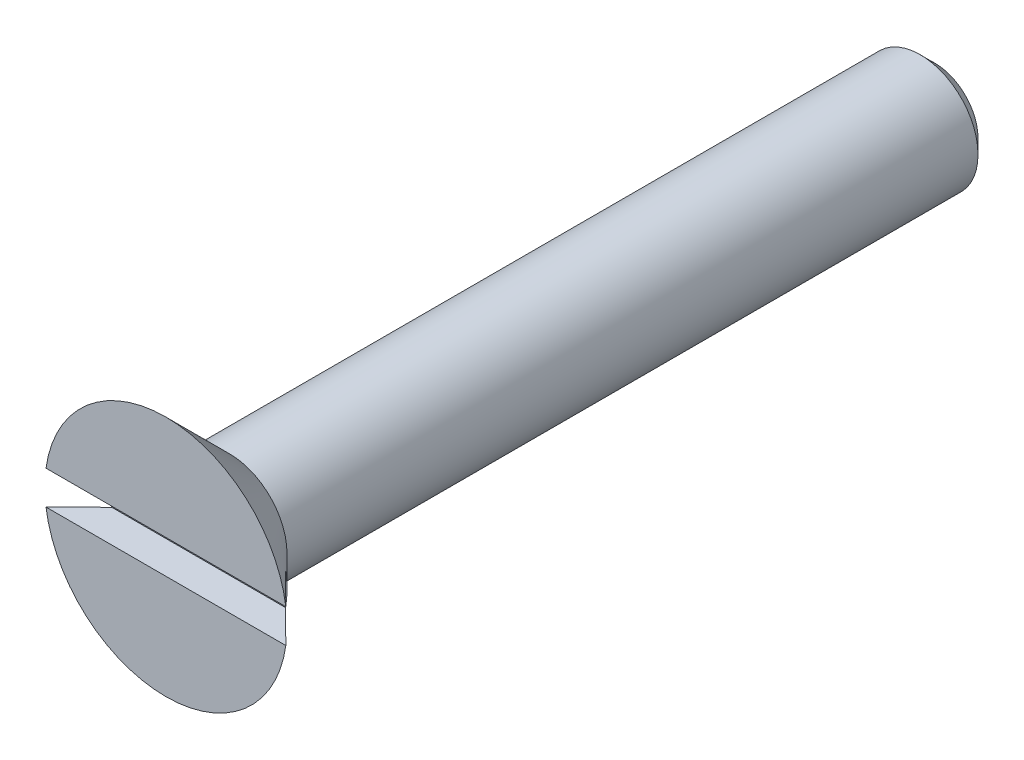
ISO-10303-21;
HEADER;
FILE_DESCRIPTION(('STEP AP214'),'2;1');
FILE_NAME('part.step','',(''),(''),'','','');
FILE_SCHEMA(('AUTOMOTIVE_DESIGN { 1 0 10303 214 1 1 1 1 }'));
ENDSEC;
DATA;
#1=APPLICATION_CONTEXT('core data for automotive mechanical design processes');
#2=APPLICATION_PROTOCOL_DEFINITION('international standard','automotive_design',2000,#1);
#3=PRODUCT_CONTEXT('',#1,'mechanical');
#4=PRODUCT('Part','Part','',(#3));
#5=PRODUCT_RELATED_PRODUCT_CATEGORY('part','',(#4));
#6=PRODUCT_DEFINITION_FORMATION('','',#4);
#7=PRODUCT_DEFINITION_CONTEXT('part definition',#1,'design');
#8=PRODUCT_DEFINITION('design','',#6,#7);
#9=PRODUCT_DEFINITION_SHAPE('','',#8);
#10=(LENGTH_UNIT() NAMED_UNIT(*) SI_UNIT(.MILLI.,.METRE.));
#11=(NAMED_UNIT(*) PLANE_ANGLE_UNIT() SI_UNIT($,.RADIAN.));
#12=(NAMED_UNIT(*) SI_UNIT($,.STERADIAN.) SOLID_ANGLE_UNIT());
#13=UNCERTAINTY_MEASURE_WITH_UNIT(LENGTH_MEASURE(1.E-05),#10,'distance_accuracy_value','');
#14=(GEOMETRIC_REPRESENTATION_CONTEXT(3) GLOBAL_UNCERTAINTY_ASSIGNED_CONTEXT((#13)) GLOBAL_UNIT_ASSIGNED_CONTEXT((#10,
#11,#12)) REPRESENTATION_CONTEXT('',''));
#15=CARTESIAN_POINT('',(0.,0.,0.));
#16=DIRECTION('',(0.,0.,1.));
#17=DIRECTION('',(1.,0.,0.));
#18=AXIS2_PLACEMENT_3D('',#15,#16,#17);
#19=CARTESIAN_POINT('',(0.,0.,1.7));
#20=DIRECTION('',(0.,0.,-1.));
#21=DIRECTION('',(-1.,0.,0.));
#22=AXIS2_PLACEMENT_3D('',#19,#20,#21);
#23=PLANE('',#22);
#24=CARTESIAN_POINT('',(0.,0.,1.7));
#25=DIRECTION('',(0.,0.,1.));
#26=DIRECTION('',(1.,0.,0.));
#27=AXIS2_PLACEMENT_3D('',#24,#25,#26);
#28=CIRCLE('',#27,3.15);
#29=CARTESIAN_POINT('',(-3.11947010724578,-0.4375,1.7));
#30=VERTEX_POINT('',#29);
#31=CARTESIAN_POINT('',(3.11947010724578,-0.4375,1.7));
#32=VERTEX_POINT('',#31);
#33=EDGE_CURVE('E106',#30,#32,#28,.T.);
#34=ORIENTED_EDGE('',*,*,#33,.T.);
#35=DIRECTION('',(1.,0.,0.));
#36=VECTOR('',#35,1.);
#37=CARTESIAN_POINT('',(-3.15,-0.4375,1.7));
#38=LINE('',#37,#36);
#39=EDGE_CURVE('E99',#30,#32,#38,.T.);
#40=ORIENTED_EDGE('',*,*,#39,.F.);
#41=EDGE_LOOP('',(#34,#40));
#42=FACE_BOUND('',#41,.T.);
#43=ADVANCED_FACE('F39',(#42),#23,.F.);
#44=CARTESIAN_POINT('',(3.11947010724578,0.4375,1.7));
#45=VERTEX_POINT('',#44);
#46=CARTESIAN_POINT('',(-3.11947010724578,0.4375,1.7));
#47=VERTEX_POINT('',#46);
#48=EDGE_CURVE('E97',#45,#47,#28,.T.);
#49=ORIENTED_EDGE('',*,*,#48,.T.);
#50=DIRECTION('',(-1.,0.,0.));
#51=VECTOR('',#50,1.);
#52=CARTESIAN_POINT('',(-3.15,0.4375,1.7));
#53=LINE('',#52,#51);
#54=EDGE_CURVE('E88',#45,#47,#53,.T.);
#55=ORIENTED_EDGE('',*,*,#54,.F.);
#56=EDGE_LOOP('',(#49,#55));
#57=FACE_BOUND('',#56,.T.);
#58=ADVANCED_FACE('F41',(#57),#23,.F.);
#59=CARTESIAN_POINT('',(0.,0.,0.0500000000000079));
#60=DIRECTION('',(0.,0.,1.));
#61=DIRECTION('',(1.,0.,0.));
#62=AXIS2_PLACEMENT_3D('',#59,#60,#61);
#63=CONICAL_SURFACE('',#62,1.5,0.785398163397451);
#64=ORIENTED_EDGE('',*,*,#33,.F.);
#65=CARTESIAN_POINT('',(-6.95069435097477,-0.4375,5.51444959854491));
#66=CARTESIAN_POINT('',(-6.71545377725601,-0.4375,5.27967721431496));
#67=CARTESIAN_POINT('',(-6.48019303350266,-0.4375,5.04492502441663));
#68=CARTESIAN_POINT('',(-6.00960192345305,-0.4375,4.57548243964187));
#69=CARTESIAN_POINT('',(-5.77427155604116,-0.4375,4.34079204588382));
#70=CARTESIAN_POINT('',(-5.30343158176121,-0.4375,3.87141438717137));
#71=CARTESIAN_POINT('',(-5.06792194077094,-0.4375,3.63672715644325));
#72=CARTESIAN_POINT('',(-4.59677017117157,-0.4375,3.16749350357989));
#73=CARTESIAN_POINT('',(-4.3611280448257,-0.4375,2.93294707917283));
#74=CARTESIAN_POINT('',(-3.87890631331682,-0.4375,2.45341460844365));
#75=CARTESIAN_POINT('',(-3.63231655090313,-0.4375,2.20843877608446));
#76=CARTESIAN_POINT('',(-3.13871112808016,-0.4375,1.71889165526523));
#77=CARTESIAN_POINT('',(-2.89169544725845,-0.4375,1.47432038736061));
#78=CARTESIAN_POINT('',(-2.52054668169718,-0.4375,1.10815678841121));
#79=CARTESIAN_POINT('',(-2.3967412827444,-0.4375,0.986232561251597));
#80=CARTESIAN_POINT('',(-2.14877789483762,-0.4375,0.74273812276414));
#81=CARTESIAN_POINT('',(-2.02461989882203,-0.4375,0.621167918626616));
#82=CARTESIAN_POINT('',(-1.77574261990939,-0.4375,0.378624419174153));
#83=CARTESIAN_POINT('',(-1.65102338979819,-0.4375,0.257651069877583));
#84=CARTESIAN_POINT('',(-1.46312840439675,-0.4375,0.0770435419685614));
#85=CARTESIAN_POINT('',(-1.40036175145822,-0.4375,0.0169840897073071));
#86=CARTESIAN_POINT('',(-1.27442762204848,-0.4375,-0.10271274659936));
#87=CARTESIAN_POINT('',(-1.21126015041921,-0.4375,-0.162350135725008));
#88=CARTESIAN_POINT('',(-1.11382173052775,-0.4375,-0.25339613639642));
#89=CARTESIAN_POINT('',(-1.07976946155462,-0.4375,-0.285038611518478));
#90=CARTESIAN_POINT('',(-1.01143604619376,-0.4375,-0.348076858100941));
#91=CARTESIAN_POINT('',(-0.977154895825766,-0.4375,-0.3794726252503));
#92=CARTESIAN_POINT('',(-0.908445877673763,-0.4375,-0.441798127970912));
#93=CARTESIAN_POINT('',(-0.874019325470927,-0.4375,-0.472729308933459));
#94=CARTESIAN_POINT('',(-0.804767226320551,-0.4375,-0.534138554654185));
#95=CARTESIAN_POINT('',(-0.7699416938768,-0.4375,-0.564616635791555));
#96=CARTESIAN_POINT('',(-0.687524321535922,-0.4375,-0.635446109424893));
#97=CARTESIAN_POINT('',(-0.63970868674946,-0.4375,-0.675541043817061));
#98=CARTESIAN_POINT('',(-0.566556991446948,-0.4375,-0.73432913801779));
#99=CARTESIAN_POINT('',(-0.54182952959947,-0.4375,-0.753777222319424));
#100=CARTESIAN_POINT('',(-0.491822543056473,-0.4375,-0.791947470581388));
#101=CARTESIAN_POINT('',(-0.466543099302396,-0.4375,-0.810669739870932));
#102=CARTESIAN_POINT('',(-0.414775435391958,-0.4375,-0.847417533943371));
#103=CARTESIAN_POINT('',(-0.388273549584466,-0.4375,-0.865423985183118));
#104=CARTESIAN_POINT('',(-0.334192522338339,-0.4375,-0.899859213763832));
#105=CARTESIAN_POINT('',(-0.306611926297403,-0.4375,-0.916285749684858));
#106=CARTESIAN_POINT('',(-0.250452865815358,-0.4375,-0.946436009532494));
#107=CARTESIAN_POINT('',(-0.221892495276722,-0.4375,-0.960192701204188));
#108=CARTESIAN_POINT('',(-0.163218417249906,-0.4375,-0.983807638318881));
#109=CARTESIAN_POINT('',(-0.133110728635988,-0.4375,-0.993679862316532));
#110=CARTESIAN_POINT('',(-0.0880223692180264,-0.4375,-1.00395141312084));
#111=CARTESIAN_POINT('',(-0.073551465305175,-0.4375,-1.00659400426285));
#112=CARTESIAN_POINT('',(-0.0444235926394925,-0.4375,-1.01048860754213));
#113=CARTESIAN_POINT('',(-0.0297666321560671,-0.4375,-1.0117406812645));
#114=CARTESIAN_POINT('',(0.0142250952761395,-0.4375,-1.01323688027924));
#115=CARTESIAN_POINT('',(0.0436649939441677,-0.4375,-1.01124128469903));
#116=CARTESIAN_POINT('',(0.101292142840405,-0.4375,-1.0018327116412));
#117=CARTESIAN_POINT('',(0.129488837077696,-0.4375,-0.994472979526124));
#118=CARTESIAN_POINT('',(0.170809309856394,-0.4375,-0.980519211556384));
#119=CARTESIAN_POINT('',(0.184454897966584,-0.4375,-0.975364865735926));
#120=CARTESIAN_POINT('',(0.211412528671322,-0.4375,-0.96425186784909));
#121=CARTESIAN_POINT('',(0.224724643745628,-0.4375,-0.958293392389047));
#122=CARTESIAN_POINT('',(0.266777045448894,-0.4375,-0.938210779497741));
#123=CARTESIAN_POINT('',(0.294921432003761,-0.4375,-0.922845882651961));
#124=CARTESIAN_POINT('',(0.350046604409141,-0.4375,-0.89013582475984));
#125=CARTESIAN_POINT('',(0.377025762743036,-0.4375,-0.87278800997322));
#126=CARTESIAN_POINT('',(0.430201279890642,-0.4375,-0.83673288612168));
#127=CARTESIAN_POINT('',(0.456394298082687,-0.4375,-0.818020690833663));
#128=CARTESIAN_POINT('',(0.50812313076528,-0.4375,-0.77970481009805));
#129=CARTESIAN_POINT('',(0.533658785434775,-0.4375,-0.760100911001922));
#130=CARTESIAN_POINT('',(0.610057648748741,-0.4375,-0.699952314625999));
#131=CARTESIAN_POINT('',(0.660169188221462,-0.4375,-0.658457053720058));
#132=CARTESIAN_POINT('',(0.759095952529052,-0.4375,-0.574228201210139));
#133=CARTESIAN_POINT('',(0.807914210937513,-0.4375,-0.531498112455194));
#134=CARTESIAN_POINT('',(0.903777928724115,-0.4375,-0.4461297183887));
#135=CARTESIAN_POINT('',(0.950838989272428,-0.4375,-0.403508906492821));
#136=CARTESIAN_POINT('',(1.04448251759101,-0.4375,-0.317745372768809));
#137=CARTESIAN_POINT('',(1.09106497765321,-0.4375,-0.274602642559246));
#138=CARTESIAN_POINT('',(1.23032604080343,-0.4375,-0.144633863624959));
#139=CARTESIAN_POINT('',(1.32250810126808,-0.4375,-0.05727648186134));
#140=CARTESIAN_POINT('',(1.50626750098789,-0.4375,0.118289223323196));
#141=CARTESIAN_POINT('',(1.59784397500925,-0.4375,0.206498447368561));
#142=CARTESIAN_POINT('',(1.78054968777642,-0.4375,0.383368131795782));
#143=CARTESIAN_POINT('',(1.8716789522241,-0.4375,0.47202856563489));
#144=CARTESIAN_POINT('',(2.0527126028453,-0.4375,0.648726833335544));
#145=CARTESIAN_POINT('',(2.14261992922196,-0.4375,0.73676165898462));
#146=CARTESIAN_POINT('',(2.32224140147481,-0.4375,0.913030831048659));
#147=CARTESIAN_POINT('',(2.41195554439885,-0.4375,1.00126518047099));
#148=CARTESIAN_POINT('',(2.68081262073546,-0.4375,1.26610037012193));
#149=CARTESIAN_POINT('',(2.85974916511933,-0.4375,1.44291065018944));
#150=CARTESIAN_POINT('',(3.36306970387667,-0.4375,1.94108895648711));
#151=CARTESIAN_POINT('',(3.68711145552849,-0.4375,2.26280243883242));
#152=CARTESIAN_POINT('',(4.33482479338633,-0.4375,2.90671341989869));
#153=CARTESIAN_POINT('',(4.65849630580628,-0.4375,3.22891099276393));
#154=CARTESIAN_POINT('',(5.31036659154146,-0.4375,3.87827901327936));
#155=CARTESIAN_POINT('',(5.63856193497032,-0.4375,4.20545290383715));
#156=CARTESIAN_POINT('',(6.29474601208318,-0.4375,4.85989136733905));
#157=CARTESIAN_POINT('',(6.6227347721014,-0.4375,5.18715591387629));
#158=CARTESIAN_POINT('',(6.95069435097477,-0.4375,5.51444959854491));
#159=B_SPLINE_CURVE_WITH_KNOTS('',3,(#65,#66,#67,#68,#69,#70,#71,#72,#73,#74,#75,#76,#77,#78,
#79,#80,#81,#82,#83,#84,#85,#86,#87,#88,#89,#90,#91,#92,#93,#94,#95,#96,#97,#98,#99,#100,#101,
#102,#103,#104,#105,#106,#107,#108,#109,#110,#111,#112,#113,#114,#115,#116,#117,#118,#119,#120,
#121,#122,#123,#124,#125,#126,#127,#128,#129,#130,#131,#132,#133,#134,#135,#136,#137,#138,#139,
#140,#141,#142,#143,#144,#145,#146,#147,#148,#149,#150,#151,#152,#153,#154,#155,#156,#157,#158),
.UNSPECIFIED.,.F.,.F.,(4,2,2,2,2,2,2,2,2,2,2,2,2,2,2,2,2,2,2,2,2,2,2,2,2,2,2,2,2,2,2,2,2,2,2,2,
2,2,2,2,2,2,2,2,2,2,4),(0.,0.997048560654659,1.99411407159498,2.9915537582241,3.98897689423789,
5.03175047299187,6.07457549937006,6.59586149567601,7.11715800663534,7.63840647212515,
7.89902218841885,8.15963476241322,8.29908714979861,8.43854196861998,8.5773812160964,
8.71621543238273,8.90338051507032,8.99774881127713,9.09210336123648,9.18818823101548,
9.28440746521176,9.37935012372772,9.473947928805,9.5180182515728,9.56208662241713,
9.64996810467844,9.73698893848584,9.78072959357587,9.82446065774542,9.92051040347212,
10.0166902318302,10.1132332446856,10.2097995119603,10.4049299988875,10.5995527867628,
10.7900231132878,10.9804965026262,11.3614846523295,11.74293313361,12.1243594294601,
12.5018522839031,12.8793508666369,13.634016533687,15.0038781067776,16.3739768056718,
17.7642265085964,19.1542294238138),.UNSPECIFIED.);
#160=CARTESIAN_POINT('',(-2.25800658767861,-0.4375,0.85));
#161=VERTEX_POINT('',#160);
#162=EDGE_CURVE('E11',#30,#161,#159,.T.);
#163=ORIENTED_EDGE('',*,*,#162,.T.);
#164=CARTESIAN_POINT('',(0.,0.,0.85));
#165=DIRECTION('',(0.,0.,1.));
#166=DIRECTION('',(1.,0.,0.));
#167=AXIS2_PLACEMENT_3D('',#164,#165,#166);
#168=CIRCLE('',#167,2.3);
#169=CARTESIAN_POINT('',(-2.25800658767861,0.4375,0.85));
#170=VERTEX_POINT('',#169);
#171=EDGE_CURVE('E111',#170,#161,#168,.T.);
#172=ORIENTED_EDGE('',*,*,#171,.F.);
#173=CARTESIAN_POINT('',(6.95069435097477,0.4375,5.51444959854491));
#174=CARTESIAN_POINT('',(6.71545377725601,0.4375,5.27967721431496));
#175=CARTESIAN_POINT('',(6.48019303350266,0.4375,5.04492502441663));
#176=CARTESIAN_POINT('',(6.00960192345305,0.4375,4.57548243964187));
#177=CARTESIAN_POINT('',(5.77427155604116,0.4375,4.34079204588382));
#178=CARTESIAN_POINT('',(5.30343158176121,0.4375,3.87141438717137));
#179=CARTESIAN_POINT('',(5.06792194077094,0.4375,3.63672715644325));
#180=CARTESIAN_POINT('',(4.59677017117157,0.4375,3.16749350357989));
#181=CARTESIAN_POINT('',(4.3611280448257,0.4375,2.93294707917283));
#182=CARTESIAN_POINT('',(3.87890631331682,0.4375,2.45341460844365));
#183=CARTESIAN_POINT('',(3.63231655090313,0.4375,2.20843877608446));
#184=CARTESIAN_POINT('',(3.13871112808016,0.4375,1.71889165526523));
#185=CARTESIAN_POINT('',(2.89169544725845,0.4375,1.47432038736061));
#186=CARTESIAN_POINT('',(2.52054668169718,0.4375,1.10815678841121));
#187=CARTESIAN_POINT('',(2.3967412827444,0.4375,0.986232561251597));
#188=CARTESIAN_POINT('',(2.14877789483762,0.4375,0.74273812276414));
#189=CARTESIAN_POINT('',(2.02461989882203,0.4375,0.621167918626616));
#190=CARTESIAN_POINT('',(1.77574261990939,0.4375,0.378624419174153));
#191=CARTESIAN_POINT('',(1.65102338979819,0.4375,0.257651069877583));
#192=CARTESIAN_POINT('',(1.46312840439675,0.4375,0.0770435419685614));
#193=CARTESIAN_POINT('',(1.40036175145822,0.4375,0.0169840897073071));
#194=CARTESIAN_POINT('',(1.27442762204848,0.4375,-0.10271274659936));
#195=CARTESIAN_POINT('',(1.21126015041921,0.4375,-0.162350135725008));
#196=CARTESIAN_POINT('',(1.11382173052775,0.4375,-0.25339613639642));
#197=CARTESIAN_POINT('',(1.07976946155462,0.4375,-0.285038611518478));
#198=CARTESIAN_POINT('',(1.01143604619376,0.4375,-0.348076858100941));
#199=CARTESIAN_POINT('',(0.977154895825766,0.4375,-0.3794726252503));
#200=CARTESIAN_POINT('',(0.908445877673763,0.4375,-0.441798127970912));
#201=CARTESIAN_POINT('',(0.874019325470927,0.4375,-0.472729308933459));
#202=CARTESIAN_POINT('',(0.804767226320551,0.4375,-0.534138554654185));
#203=CARTESIAN_POINT('',(0.7699416938768,0.4375,-0.564616635791555));
#204=CARTESIAN_POINT('',(0.687524321535922,0.4375,-0.635446109424893));
#205=CARTESIAN_POINT('',(0.63970868674946,0.4375,-0.675541043817061));
#206=CARTESIAN_POINT('',(0.566556991446948,0.4375,-0.73432913801779));
#207=CARTESIAN_POINT('',(0.54182952959947,0.4375,-0.753777222319424));
#208=CARTESIAN_POINT('',(0.491822543056473,0.4375,-0.791947470581388));
#209=CARTESIAN_POINT('',(0.466543099302396,0.4375,-0.810669739870932));
#210=CARTESIAN_POINT('',(0.414775435391958,0.4375,-0.847417533943371));
#211=CARTESIAN_POINT('',(0.388273549584466,0.4375,-0.865423985183118));
#212=CARTESIAN_POINT('',(0.334192522338339,0.4375,-0.899859213763832));
#213=CARTESIAN_POINT('',(0.306611926297403,0.4375,-0.916285749684858));
#214=CARTESIAN_POINT('',(0.250452865815358,0.4375,-0.946436009532494));
#215=CARTESIAN_POINT('',(0.221892495276722,0.4375,-0.960192701204188));
#216=CARTESIAN_POINT('',(0.163218417249906,0.4375,-0.983807638318881));
#217=CARTESIAN_POINT('',(0.133110728635988,0.4375,-0.993679862316532));
#218=CARTESIAN_POINT('',(0.0880223692180264,0.4375,-1.00395141312084));
#219=CARTESIAN_POINT('',(0.073551465305175,0.4375,-1.00659400426285));
#220=CARTESIAN_POINT('',(0.0444235926394925,0.4375,-1.01048860754213));
#221=CARTESIAN_POINT('',(0.0297666321560671,0.4375,-1.0117406812645));
#222=CARTESIAN_POINT('',(-0.0142250952761395,0.4375,-1.01323688027924));
#223=CARTESIAN_POINT('',(-0.0436649939441677,0.4375,-1.01124128469903));
#224=CARTESIAN_POINT('',(-0.101292142840405,0.4375,-1.0018327116412));
#225=CARTESIAN_POINT('',(-0.129488837077696,0.4375,-0.994472979526124));
#226=CARTESIAN_POINT('',(-0.170809309856394,0.4375,-0.980519211556384));
#227=CARTESIAN_POINT('',(-0.184454897966584,0.4375,-0.975364865735926));
#228=CARTESIAN_POINT('',(-0.211412528671322,0.4375,-0.96425186784909));
#229=CARTESIAN_POINT('',(-0.224724643745628,0.4375,-0.958293392389047));
#230=CARTESIAN_POINT('',(-0.266777045448894,0.4375,-0.938210779497741));
#231=CARTESIAN_POINT('',(-0.294921432003761,0.4375,-0.922845882651961));
#232=CARTESIAN_POINT('',(-0.350046604409141,0.4375,-0.89013582475984));
#233=CARTESIAN_POINT('',(-0.377025762743036,0.4375,-0.87278800997322));
#234=CARTESIAN_POINT('',(-0.430201279890642,0.4375,-0.83673288612168));
#235=CARTESIAN_POINT('',(-0.456394298082687,0.4375,-0.818020690833663));
#236=CARTESIAN_POINT('',(-0.50812313076528,0.4375,-0.77970481009805));
#237=CARTESIAN_POINT('',(-0.533658785434775,0.4375,-0.760100911001922));
#238=CARTESIAN_POINT('',(-0.610057648748741,0.4375,-0.699952314625999));
#239=CARTESIAN_POINT('',(-0.660169188221462,0.4375,-0.658457053720058));
#240=CARTESIAN_POINT('',(-0.759095952529052,0.4375,-0.574228201210139));
#241=CARTESIAN_POINT('',(-0.807914210937513,0.4375,-0.531498112455194));
#242=CARTESIAN_POINT('',(-0.903777928724115,0.4375,-0.4461297183887));
#243=CARTESIAN_POINT('',(-0.950838989272428,0.4375,-0.403508906492821));
#244=CARTESIAN_POINT('',(-1.04448251759101,0.4375,-0.317745372768809));
#245=CARTESIAN_POINT('',(-1.09106497765321,0.4375,-0.274602642559246));
#246=CARTESIAN_POINT('',(-1.23032604080343,0.4375,-0.144633863624959));
#247=CARTESIAN_POINT('',(-1.32250810126808,0.4375,-0.05727648186134));
#248=CARTESIAN_POINT('',(-1.50626750098789,0.4375,0.118289223323196));
#249=CARTESIAN_POINT('',(-1.59784397500925,0.4375,0.206498447368561));
#250=CARTESIAN_POINT('',(-1.78054968777642,0.4375,0.383368131795782));
#251=CARTESIAN_POINT('',(-1.8716789522241,0.4375,0.47202856563489));
#252=CARTESIAN_POINT('',(-2.0527126028453,0.4375,0.648726833335544));
#253=CARTESIAN_POINT('',(-2.14261992922196,0.4375,0.73676165898462));
#254=CARTESIAN_POINT('',(-2.32224140147481,0.4375,0.913030831048659));
#255=CARTESIAN_POINT('',(-2.41195554439885,0.4375,1.00126518047099));
#256=CARTESIAN_POINT('',(-2.68081262073546,0.4375,1.26610037012193));
#257=CARTESIAN_POINT('',(-2.85974916511933,0.4375,1.44291065018944));
#258=CARTESIAN_POINT('',(-3.36306970387667,0.4375,1.94108895648711));
#259=CARTESIAN_POINT('',(-3.68711145552849,0.4375,2.26280243883242));
#260=CARTESIAN_POINT('',(-4.33482479338633,0.4375,2.90671341989869));
#261=CARTESIAN_POINT('',(-4.65849630580628,0.4375,3.22891099276393));
#262=CARTESIAN_POINT('',(-5.31036659154146,0.4375,3.87827901327936));
#263=CARTESIAN_POINT('',(-5.63856193497032,0.4375,4.20545290383715));
#264=CARTESIAN_POINT('',(-6.29474601208318,0.4375,4.85989136733905));
#265=CARTESIAN_POINT('',(-6.6227347721014,0.4375,5.18715591387629));
#266=CARTESIAN_POINT('',(-6.95069435097477,0.4375,5.51444959854491));
#267=B_SPLINE_CURVE_WITH_KNOTS('',3,(#173,#174,#175,#176,#177,#178,#179,#180,#181,#182,#183,
#184,#185,#186,#187,#188,#189,#190,#191,#192,#193,#194,#195,#196,#197,#198,#199,#200,#201,#202,
#203,#204,#205,#206,#207,#208,#209,#210,#211,#212,#213,#214,#215,#216,#217,#218,#219,#220,#221,
#222,#223,#224,#225,#226,#227,#228,#229,#230,#231,#232,#233,#234,#235,#236,#237,#238,#239,#240,
#241,#242,#243,#244,#245,#246,#247,#248,#249,#250,#251,#252,#253,#254,#255,#256,#257,#258,#259,
#260,#261,#262,#263,#264,#265,#266),.UNSPECIFIED.,.F.,.F.,(4,2,2,2,2,2,2,2,2,2,2,2,2,2,2,2,2,2,
2,2,2,2,2,2,2,2,2,2,2,2,2,2,2,2,2,2,2,2,2,2,2,2,2,2,2,2,4),(0.,0.997048560654659,
1.99411407159498,2.9915537582241,3.98897689423789,5.03175047299187,6.07457549937006,
6.59586149567601,7.11715800663534,7.63840647212515,7.89902218841885,8.15963476241322,
8.29908714979861,8.43854196861998,8.5773812160964,8.71621543238273,8.90338051507032,
8.99774881127713,9.09210336123648,9.18818823101548,9.28440746521176,9.37935012372772,
9.473947928805,9.5180182515728,9.56208662241713,9.64996810467844,9.73698893848584,
9.78072959357587,9.82446065774542,9.92051040347212,10.0166902318302,10.1132332446856,
10.2097995119603,10.4049299988875,10.5995527867628,10.7900231132878,10.9804965026262,
11.3614846523295,11.74293313361,12.1243594294601,12.5018522839031,12.8793508666369,
13.634016533687,15.0038781067776,16.3739768056718,17.7642265085964,19.1542294238138),.UNSPECIFIED.);
#268=EDGE_CURVE('E54',#170,#47,#267,.T.);
#269=ORIENTED_EDGE('',*,*,#268,.T.);
#270=ORIENTED_EDGE('',*,*,#48,.F.);
#271=CARTESIAN_POINT('',(2.25800658767861,0.4375,0.85));
#272=VERTEX_POINT('',#271);
#273=EDGE_CURVE('E85',#45,#272,#267,.T.);
#274=ORIENTED_EDGE('',*,*,#273,.T.);
#275=CARTESIAN_POINT('',(2.25800658767861,-0.4375,0.85));
#276=VERTEX_POINT('',#275);
#277=EDGE_CURVE('E94',#276,#272,#168,.T.);
#278=ORIENTED_EDGE('',*,*,#277,.F.);
#279=EDGE_CURVE('E43',#276,#32,#159,.T.);
#280=ORIENTED_EDGE('',*,*,#279,.T.);
#281=EDGE_LOOP('',(#64,#163,#172,#269,#270,#274,#278,#280));
#282=FACE_BOUND('',#281,.T.);
#283=CARTESIAN_POINT('',(0.,0.,0.0500000000000079));
#284=DIRECTION('',(0.,0.,1.));
#285=DIRECTION('',(1.,0.,0.));
#286=AXIS2_PLACEMENT_3D('',#283,#284,#285);
#287=CIRCLE('',#286,1.5);
#288=CARTESIAN_POINT('',(1.5,0.,0.0500000000000079));
#289=VERTEX_POINT('',#288);
#290=EDGE_CURVE('E113',#289,#289,#287,.T.);
#291=ORIENTED_EDGE('',*,*,#290,.T.);
#292=EDGE_LOOP('',(#291));
#293=FACE_BOUND('',#292,.T.);
#294=ADVANCED_FACE('F102',(#282,#293),#63,.T.);
#295=CARTESIAN_POINT('',(0.,0.,1.7));
#296=DIRECTION('',(0.,0.,1.));
#297=DIRECTION('',(1.,0.,0.));
#298=AXIS2_PLACEMENT_3D('',#295,#296,#297);
#299=CYLINDRICAL_SURFACE('',#298,1.5);
#300=ORIENTED_EDGE('',*,*,#290,.F.);
#301=EDGE_LOOP('',(#300));
#302=FACE_BOUND('',#301,.T.);
#303=CARTESIAN_POINT('',(0.,0.,-17.925));
#304=DIRECTION('',(0.,0.,1.));
#305=DIRECTION('',(1.,0.,0.));
#306=AXIS2_PLACEMENT_3D('',#303,#304,#305);
#307=CIRCLE('',#306,1.5);
#308=CARTESIAN_POINT('',(1.5,0.,-17.925));
#309=VERTEX_POINT('',#308);
#310=EDGE_CURVE('E162',#309,#309,#307,.T.);
#311=ORIENTED_EDGE('',*,*,#310,.T.);
#312=EDGE_LOOP('',(#311));
#313=FACE_BOUND('',#312,.T.);
#314=ADVANCED_FACE('F136',(#302,#313),#299,.T.);
#315=CARTESIAN_POINT('',(0.,0.,-18.3));
#316=DIRECTION('',(0.,0.,1.));
#317=DIRECTION('',(1.,0.,0.));
#318=AXIS2_PLACEMENT_3D('',#315,#316,#317);
#319=CONICAL_SURFACE('',#318,1.125,0.785398163397453);
#320=ORIENTED_EDGE('',*,*,#310,.F.);
#321=EDGE_LOOP('',(#320));
#322=FACE_BOUND('',#321,.T.);
#323=CARTESIAN_POINT('',(0.,0.,-18.3));
#324=DIRECTION('',(0.,0.,1.));
#325=DIRECTION('',(1.,0.,0.));
#326=AXIS2_PLACEMENT_3D('',#323,#324,#325);
#327=CIRCLE('',#326,1.125);
#328=CARTESIAN_POINT('',(1.125,0.,-18.3));
#329=VERTEX_POINT('',#328);
#330=EDGE_CURVE('E157',#329,#329,#327,.T.);
#331=ORIENTED_EDGE('',*,*,#330,.T.);
#332=EDGE_LOOP('',(#331));
#333=FACE_BOUND('',#332,.T.);
#334=ADVANCED_FACE('F133',(#322,#333),#319,.T.);
#335=CARTESIAN_POINT('',(0.,1.125,-18.3));
#336=DIRECTION('',(0.,0.,1.));
#337=DIRECTION('',(1.,0.,0.));
#338=AXIS2_PLACEMENT_3D('',#335,#336,#337);
#339=PLANE('',#338);
#340=ORIENTED_EDGE('',*,*,#330,.F.);
#341=EDGE_LOOP('',(#340));
#342=FACE_BOUND('',#341,.T.);
#343=ADVANCED_FACE('F130',(#342),#339,.F.);
#344=CARTESIAN_POINT('',(-3.15,-0.4375,0.85));
#345=DIRECTION('',(0.,-1.,0.));
#346=DIRECTION('',(0.,0.,-1.));
#347=AXIS2_PLACEMENT_3D('',#344,#345,#346);
#348=PLANE('',#347);
#349=ORIENTED_EDGE('',*,*,#39,.T.);
#350=ORIENTED_EDGE('',*,*,#279,.F.);
#351=DIRECTION('',(1.,0.,0.));
#352=VECTOR('',#351,1.);
#353=CARTESIAN_POINT('',(-3.15,-0.4375,0.85));
#354=LINE('',#353,#352);
#355=EDGE_CURVE('E61',#161,#276,#354,.T.);
#356=ORIENTED_EDGE('',*,*,#355,.F.);
#357=ORIENTED_EDGE('',*,*,#162,.F.);
#358=EDGE_LOOP('',(#349,#350,#356,#357));
#359=FACE_BOUND('',#358,.T.);
#360=ADVANCED_FACE('F127',(#359),#348,.F.);
#361=CARTESIAN_POINT('',(-3.15,0.4375,0.85));
#362=DIRECTION('',(0.,1.,0.));
#363=DIRECTION('',(0.,0.,1.));
#364=AXIS2_PLACEMENT_3D('',#361,#362,#363);
#365=PLANE('',#364);
#366=ORIENTED_EDGE('',*,*,#54,.T.);
#367=ORIENTED_EDGE('',*,*,#268,.F.);
#368=DIRECTION('',(-1.,0.,0.));
#369=VECTOR('',#368,1.);
#370=CARTESIAN_POINT('',(-3.15,0.4375,0.85));
#371=LINE('',#370,#369);
#372=EDGE_CURVE('E89',#272,#170,#371,.T.);
#373=ORIENTED_EDGE('',*,*,#372,.F.);
#374=ORIENTED_EDGE('',*,*,#273,.F.);
#375=EDGE_LOOP('',(#366,#367,#373,#374));
#376=FACE_BOUND('',#375,.T.);
#377=ADVANCED_FACE('F87',(#376),#365,.F.);
#378=CARTESIAN_POINT('',(0.,0.,0.85));
#379=DIRECTION('',(0.,0.,1.));
#380=DIRECTION('',(1.,0.,0.));
#381=AXIS2_PLACEMENT_3D('',#378,#379,#380);
#382=PLANE('',#381);
#383=ORIENTED_EDGE('',*,*,#171,.T.);
#384=ORIENTED_EDGE('',*,*,#355,.T.);
#385=ORIENTED_EDGE('',*,*,#277,.T.);
#386=ORIENTED_EDGE('',*,*,#372,.T.);
#387=EDGE_LOOP('',(#383,#384,#385,#386));
#388=FACE_BOUND('',#387,.T.);
#389=ADVANCED_FACE('F126',(#388),#382,.T.);
#390=CLOSED_SHELL('',(#43,#58,#294,#314,#334,#343,#360,#377,#389));
#391=MANIFOLD_SOLID_BREP('B2',#390);
#392=ADVANCED_BREP_SHAPE_REPRESENTATION('',(#18,#391),#14);
#393=SHAPE_DEFINITION_REPRESENTATION(#9,#392);
ENDSEC;
END-ISO-10303-21;
